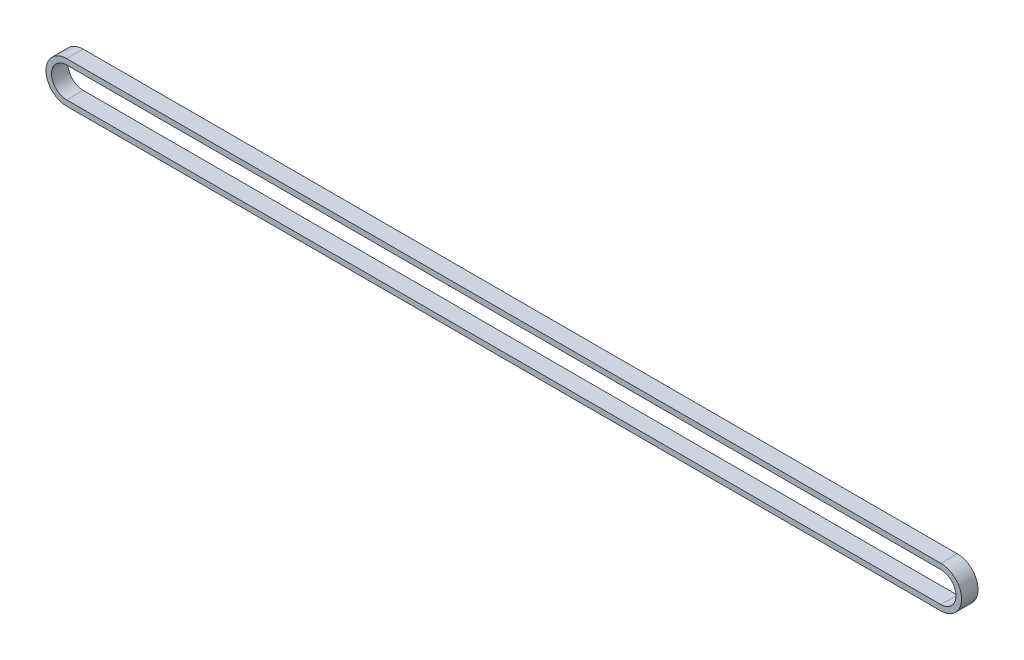
ISO-10303-21;
HEADER;
FILE_DESCRIPTION(('STEP AP214'),'2;1');
FILE_NAME('part.step','',(''),(''),'','','');
FILE_SCHEMA(('AUTOMOTIVE_DESIGN { 1 0 10303 214 1 1 1 1 }'));
ENDSEC;
DATA;
#1=APPLICATION_CONTEXT('core data for automotive mechanical design processes');
#2=APPLICATION_PROTOCOL_DEFINITION('international standard','automotive_design',2000,#1);
#3=PRODUCT_CONTEXT('',#1,'mechanical');
#4=PRODUCT('Part','Part','',(#3));
#5=PRODUCT_RELATED_PRODUCT_CATEGORY('part','',(#4));
#6=PRODUCT_DEFINITION_FORMATION('','',#4);
#7=PRODUCT_DEFINITION_CONTEXT('part definition',#1,'design');
#8=PRODUCT_DEFINITION('design','',#6,#7);
#9=PRODUCT_DEFINITION_SHAPE('','',#8);
#10=(LENGTH_UNIT() NAMED_UNIT(*) SI_UNIT(.MILLI.,.METRE.));
#11=(NAMED_UNIT(*) PLANE_ANGLE_UNIT() SI_UNIT($,.RADIAN.));
#12=(NAMED_UNIT(*) SI_UNIT($,.STERADIAN.) SOLID_ANGLE_UNIT());
#13=UNCERTAINTY_MEASURE_WITH_UNIT(LENGTH_MEASURE(1.E-05),#10,'distance_accuracy_value','');
#14=(GEOMETRIC_REPRESENTATION_CONTEXT(3) GLOBAL_UNCERTAINTY_ASSIGNED_CONTEXT((#13)) GLOBAL_UNIT_ASSIGNED_CONTEXT((#10,
#11,#12)) REPRESENTATION_CONTEXT('',''));
#15=CARTESIAN_POINT('',(0.,0.,0.));
#16=DIRECTION('',(0.,0.,1.));
#17=DIRECTION('',(1.,0.,0.));
#18=AXIS2_PLACEMENT_3D('',#15,#16,#17);
#19=CARTESIAN_POINT('',(0.,0.,6.));
#20=DIRECTION('',(0.,0.,1.));
#21=DIRECTION('',(1.,0.,0.));
#22=AXIS2_PLACEMENT_3D('',#19,#20,#21);
#23=PLANE('',#22);
#24=CARTESIAN_POINT('',(0.,0.,6.));
#25=DIRECTION('',(0.,0.,1.));
#26=DIRECTION('',(1.,0.,0.));
#27=AXIS2_PLACEMENT_3D('',#24,#25,#26);
#28=CIRCLE('',#27,7.5);
#29=CARTESIAN_POINT('',(0.,7.5,6.));
#30=VERTEX_POINT('',#29);
#31=CARTESIAN_POINT('',(0.,-7.5,6.));
#32=VERTEX_POINT('',#31);
#33=EDGE_CURVE('E136',#30,#32,#28,.T.);
#34=ORIENTED_EDGE('',*,*,#33,.T.);
#35=DIRECTION('',(1.,0.,0.));
#36=VECTOR('',#35,1.);
#37=CARTESIAN_POINT('',(0.,-7.5,6.));
#38=LINE('',#37,#36);
#39=CARTESIAN_POINT('',(318.,-7.5,6.));
#40=VERTEX_POINT('',#39);
#41=EDGE_CURVE('E139',#32,#40,#38,.T.);
#42=ORIENTED_EDGE('',*,*,#41,.T.);
#43=CARTESIAN_POINT('',(318.,0.,6.));
#44=DIRECTION('',(0.,0.,1.));
#45=DIRECTION('',(1.,0.,0.));
#46=AXIS2_PLACEMENT_3D('',#43,#44,#45);
#47=CIRCLE('',#46,7.5);
#48=CARTESIAN_POINT('',(318.,7.5,6.));
#49=VERTEX_POINT('',#48);
#50=EDGE_CURVE('E142',#40,#49,#47,.T.);
#51=ORIENTED_EDGE('',*,*,#50,.T.);
#52=DIRECTION('',(-1.,0.,0.));
#53=VECTOR('',#52,1.);
#54=CARTESIAN_POINT('',(0.,7.5,6.));
#55=LINE('',#54,#53);
#56=EDGE_CURVE('E144',#49,#30,#55,.T.);
#57=ORIENTED_EDGE('',*,*,#56,.T.);
#58=EDGE_LOOP('',(#34,#42,#51,#57));
#59=FACE_BOUND('',#58,.T.);
#60=DIRECTION('',(1.,0.,0.));
#61=VECTOR('',#60,1.);
#62=CARTESIAN_POINT('',(0.,-5.5,6.));
#63=LINE('',#62,#61);
#64=CARTESIAN_POINT('',(0.,-5.5,6.));
#65=VERTEX_POINT('',#64);
#66=CARTESIAN_POINT('',(318.,-5.5,6.));
#67=VERTEX_POINT('',#66);
#68=EDGE_CURVE('E108',#65,#67,#63,.T.);
#69=ORIENTED_EDGE('',*,*,#68,.F.);
#70=CARTESIAN_POINT('',(0.,0.,6.));
#71=DIRECTION('',(0.,0.,1.));
#72=DIRECTION('',(1.,0.,0.));
#73=AXIS2_PLACEMENT_3D('',#70,#71,#72);
#74=CIRCLE('',#73,5.5);
#75=CARTESIAN_POINT('',(0.,5.5,6.));
#76=VERTEX_POINT('',#75);
#77=EDGE_CURVE('E100',#76,#65,#74,.T.);
#78=ORIENTED_EDGE('',*,*,#77,.F.);
#79=DIRECTION('',(-1.,0.,0.));
#80=VECTOR('',#79,1.);
#81=CARTESIAN_POINT('',(0.,5.5,6.));
#82=LINE('',#81,#80);
#83=CARTESIAN_POINT('',(318.,5.5,6.));
#84=VERTEX_POINT('',#83);
#85=EDGE_CURVE('E122',#84,#76,#82,.T.);
#86=ORIENTED_EDGE('',*,*,#85,.F.);
#87=CARTESIAN_POINT('',(318.,0.,6.));
#88=DIRECTION('',(0.,0.,1.));
#89=DIRECTION('',(1.,0.,0.));
#90=AXIS2_PLACEMENT_3D('',#87,#88,#89);
#91=CIRCLE('',#90,5.5);
#92=EDGE_CURVE('E120',#67,#84,#91,.T.);
#93=ORIENTED_EDGE('',*,*,#92,.F.);
#94=EDGE_LOOP('',(#69,#78,#86,#93));
#95=FACE_BOUND('',#94,.T.);
#96=ADVANCED_FACE('F35',(#59,#95),#23,.T.);
#97=CARTESIAN_POINT('',(0.,0.,0.));
#98=DIRECTION('',(0.,0.,1.));
#99=DIRECTION('',(1.,0.,0.));
#100=AXIS2_PLACEMENT_3D('',#97,#98,#99);
#101=PLANE('',#100);
#102=CARTESIAN_POINT('',(0.,0.,0.));
#103=DIRECTION('',(0.,0.,1.));
#104=DIRECTION('',(1.,0.,0.));
#105=AXIS2_PLACEMENT_3D('',#102,#103,#104);
#106=CIRCLE('',#105,7.5);
#107=CARTESIAN_POINT('',(0.,7.5,0.));
#108=VERTEX_POINT('',#107);
#109=CARTESIAN_POINT('',(0.,-7.5,0.));
#110=VERTEX_POINT('',#109);
#111=EDGE_CURVE('E116',#108,#110,#106,.T.);
#112=ORIENTED_EDGE('',*,*,#111,.F.);
#113=DIRECTION('',(-1.,0.,0.));
#114=VECTOR('',#113,1.);
#115=CARTESIAN_POINT('',(0.,7.5,0.));
#116=LINE('',#115,#114);
#117=CARTESIAN_POINT('',(318.,7.5,0.));
#118=VERTEX_POINT('',#117);
#119=EDGE_CURVE('E140',#118,#108,#116,.T.);
#120=ORIENTED_EDGE('',*,*,#119,.F.);
#121=CARTESIAN_POINT('',(318.,0.,0.));
#122=DIRECTION('',(0.,0.,1.));
#123=DIRECTION('',(1.,0.,0.));
#124=AXIS2_PLACEMENT_3D('',#121,#122,#123);
#125=CIRCLE('',#124,7.5);
#126=CARTESIAN_POINT('',(318.,-7.5,0.));
#127=VERTEX_POINT('',#126);
#128=EDGE_CURVE('E151',#127,#118,#125,.T.);
#129=ORIENTED_EDGE('',*,*,#128,.F.);
#130=DIRECTION('',(1.,0.,0.));
#131=VECTOR('',#130,1.);
#132=CARTESIAN_POINT('',(0.,-7.5,0.));
#133=LINE('',#132,#131);
#134=EDGE_CURVE('E149',#110,#127,#133,.T.);
#135=ORIENTED_EDGE('',*,*,#134,.F.);
#136=EDGE_LOOP('',(#112,#120,#129,#135));
#137=FACE_BOUND('',#136,.T.);
#138=CARTESIAN_POINT('',(0.,0.,0.));
#139=DIRECTION('',(0.,0.,1.));
#140=DIRECTION('',(1.,0.,0.));
#141=AXIS2_PLACEMENT_3D('',#138,#139,#140);
#142=CIRCLE('',#141,5.5);
#143=CARTESIAN_POINT('',(0.,5.5,0.));
#144=VERTEX_POINT('',#143);
#145=CARTESIAN_POINT('',(0.,-5.5,0.));
#146=VERTEX_POINT('',#145);
#147=EDGE_CURVE('E58',#144,#146,#142,.T.);
#148=ORIENTED_EDGE('',*,*,#147,.T.);
#149=DIRECTION('',(1.,0.,0.));
#150=VECTOR('',#149,1.);
#151=CARTESIAN_POINT('',(0.,-5.5,0.));
#152=LINE('',#151,#150);
#153=CARTESIAN_POINT('',(318.,-5.5,0.));
#154=VERTEX_POINT('',#153);
#155=EDGE_CURVE('E115',#146,#154,#152,.T.);
#156=ORIENTED_EDGE('',*,*,#155,.T.);
#157=CARTESIAN_POINT('',(318.,0.,0.));
#158=DIRECTION('',(0.,0.,1.));
#159=DIRECTION('',(1.,0.,0.));
#160=AXIS2_PLACEMENT_3D('',#157,#158,#159);
#161=CIRCLE('',#160,5.5);
#162=CARTESIAN_POINT('',(318.,5.5,0.));
#163=VERTEX_POINT('',#162);
#164=EDGE_CURVE('E128',#154,#163,#161,.T.);
#165=ORIENTED_EDGE('',*,*,#164,.T.);
#166=DIRECTION('',(-1.,0.,0.));
#167=VECTOR('',#166,1.);
#168=CARTESIAN_POINT('',(0.,5.5,0.));
#169=LINE('',#168,#167);
#170=EDGE_CURVE('E109',#163,#144,#169,.T.);
#171=ORIENTED_EDGE('',*,*,#170,.T.);
#172=EDGE_LOOP('',(#148,#156,#165,#171));
#173=FACE_BOUND('',#172,.T.);
#174=ADVANCED_FACE('F169',(#137,#173),#101,.F.);
#175=CARTESIAN_POINT('',(0.,0.,6.));
#176=DIRECTION('',(0.,0.,-1.));
#177=DIRECTION('',(-1.,0.,0.));
#178=AXIS2_PLACEMENT_3D('',#175,#176,#177);
#179=CYLINDRICAL_SURFACE('',#178,7.5);
#180=ORIENTED_EDGE('',*,*,#111,.T.);
#181=DIRECTION('',(0.,0.,-1.));
#182=VECTOR('',#181,1.);
#183=CARTESIAN_POINT('',(0.,-7.5,6.));
#184=LINE('',#183,#182);
#185=EDGE_CURVE('E11',#32,#110,#184,.T.);
#186=ORIENTED_EDGE('',*,*,#185,.F.);
#187=ORIENTED_EDGE('',*,*,#33,.F.);
#188=DIRECTION('',(0.,0.,-1.));
#189=VECTOR('',#188,1.);
#190=CARTESIAN_POINT('',(0.,7.5,6.));
#191=LINE('',#190,#189);
#192=EDGE_CURVE('E146',#30,#108,#191,.T.);
#193=ORIENTED_EDGE('',*,*,#192,.T.);
#194=EDGE_LOOP('',(#180,#186,#187,#193));
#195=FACE_BOUND('',#194,.T.);
#196=ADVANCED_FACE('F37',(#195),#179,.T.);
#197=CARTESIAN_POINT('',(0.,-7.5,6.));
#198=DIRECTION('',(0.,1.,0.));
#199=DIRECTION('',(0.,0.,1.));
#200=AXIS2_PLACEMENT_3D('',#197,#198,#199);
#201=PLANE('',#200);
#202=ORIENTED_EDGE('',*,*,#134,.T.);
#203=DIRECTION('',(0.,0.,-1.));
#204=VECTOR('',#203,1.);
#205=CARTESIAN_POINT('',(318.,-7.5,6.));
#206=LINE('',#205,#204);
#207=EDGE_CURVE('E43',#40,#127,#206,.T.);
#208=ORIENTED_EDGE('',*,*,#207,.F.);
#209=ORIENTED_EDGE('',*,*,#41,.F.);
#210=ORIENTED_EDGE('',*,*,#185,.T.);
#211=EDGE_LOOP('',(#202,#208,#209,#210));
#212=FACE_BOUND('',#211,.T.);
#213=ADVANCED_FACE('F179',(#212),#201,.F.);
#214=CARTESIAN_POINT('',(318.,0.,6.));
#215=DIRECTION('',(0.,0.,-1.));
#216=DIRECTION('',(-1.,0.,0.));
#217=AXIS2_PLACEMENT_3D('',#214,#215,#216);
#218=CYLINDRICAL_SURFACE('',#217,7.5);
#219=ORIENTED_EDGE('',*,*,#128,.T.);
#220=DIRECTION('',(0.,0.,-1.));
#221=VECTOR('',#220,1.);
#222=CARTESIAN_POINT('',(318.,7.5,6.));
#223=LINE('',#222,#221);
#224=EDGE_CURVE('E156',#49,#118,#223,.T.);
#225=ORIENTED_EDGE('',*,*,#224,.F.);
#226=ORIENTED_EDGE('',*,*,#50,.F.);
#227=ORIENTED_EDGE('',*,*,#207,.T.);
#228=EDGE_LOOP('',(#219,#225,#226,#227));
#229=FACE_BOUND('',#228,.T.);
#230=ADVANCED_FACE('F163',(#229),#218,.T.);
#231=CARTESIAN_POINT('',(0.,7.5,6.));
#232=DIRECTION('',(0.,-1.,0.));
#233=DIRECTION('',(0.,0.,-1.));
#234=AXIS2_PLACEMENT_3D('',#231,#232,#233);
#235=PLANE('',#234);
#236=ORIENTED_EDGE('',*,*,#119,.T.);
#237=ORIENTED_EDGE('',*,*,#192,.F.);
#238=ORIENTED_EDGE('',*,*,#56,.F.);
#239=ORIENTED_EDGE('',*,*,#224,.T.);
#240=EDGE_LOOP('',(#236,#237,#238,#239));
#241=FACE_BOUND('',#240,.T.);
#242=ADVANCED_FACE('F173',(#241),#235,.F.);
#243=CARTESIAN_POINT('',(0.,0.,6.));
#244=DIRECTION('',(0.,0.,-1.));
#245=DIRECTION('',(-1.,0.,0.));
#246=AXIS2_PLACEMENT_3D('',#243,#244,#245);
#247=CYLINDRICAL_SURFACE('',#246,5.5);
#248=ORIENTED_EDGE('',*,*,#147,.F.);
#249=DIRECTION('',(0.,0.,-1.));
#250=VECTOR('',#249,1.);
#251=CARTESIAN_POINT('',(0.,5.5,6.));
#252=LINE('',#251,#250);
#253=EDGE_CURVE('E104',#76,#144,#252,.T.);
#254=ORIENTED_EDGE('',*,*,#253,.F.);
#255=ORIENTED_EDGE('',*,*,#77,.T.);
#256=DIRECTION('',(0.,0.,-1.));
#257=VECTOR('',#256,1.);
#258=CARTESIAN_POINT('',(0.,-5.5,6.));
#259=LINE('',#258,#257);
#260=EDGE_CURVE('E103',#65,#146,#259,.T.);
#261=ORIENTED_EDGE('',*,*,#260,.T.);
#262=EDGE_LOOP('',(#248,#254,#255,#261));
#263=FACE_BOUND('',#262,.T.);
#264=ADVANCED_FACE('F102',(#263),#247,.F.);
#265=CARTESIAN_POINT('',(0.,-5.5,6.));
#266=DIRECTION('',(0.,1.,0.));
#267=DIRECTION('',(0.,0.,1.));
#268=AXIS2_PLACEMENT_3D('',#265,#266,#267);
#269=PLANE('',#268);
#270=ORIENTED_EDGE('',*,*,#155,.F.);
#271=ORIENTED_EDGE('',*,*,#260,.F.);
#272=ORIENTED_EDGE('',*,*,#68,.T.);
#273=DIRECTION('',(0.,0.,-1.));
#274=VECTOR('',#273,1.);
#275=CARTESIAN_POINT('',(318.,-5.5,6.));
#276=LINE('',#275,#274);
#277=EDGE_CURVE('E117',#67,#154,#276,.T.);
#278=ORIENTED_EDGE('',*,*,#277,.T.);
#279=EDGE_LOOP('',(#270,#271,#272,#278));
#280=FACE_BOUND('',#279,.T.);
#281=ADVANCED_FACE('F112',(#280),#269,.T.);
#282=CARTESIAN_POINT('',(318.,0.,6.));
#283=DIRECTION('',(0.,0.,-1.));
#284=DIRECTION('',(-1.,0.,0.));
#285=AXIS2_PLACEMENT_3D('',#282,#283,#284);
#286=CYLINDRICAL_SURFACE('',#285,5.5);
#287=ORIENTED_EDGE('',*,*,#164,.F.);
#288=ORIENTED_EDGE('',*,*,#277,.F.);
#289=ORIENTED_EDGE('',*,*,#92,.T.);
#290=DIRECTION('',(0.,0.,-1.));
#291=VECTOR('',#290,1.);
#292=CARTESIAN_POINT('',(318.,5.5,6.));
#293=LINE('',#292,#291);
#294=EDGE_CURVE('E50',#84,#163,#293,.T.);
#295=ORIENTED_EDGE('',*,*,#294,.T.);
#296=EDGE_LOOP('',(#287,#288,#289,#295));
#297=FACE_BOUND('',#296,.T.);
#298=ADVANCED_FACE('F202',(#297),#286,.F.);
#299=CARTESIAN_POINT('',(0.,5.5,6.));
#300=DIRECTION('',(0.,-1.,0.));
#301=DIRECTION('',(0.,0.,-1.));
#302=AXIS2_PLACEMENT_3D('',#299,#300,#301);
#303=PLANE('',#302);
#304=ORIENTED_EDGE('',*,*,#170,.F.);
#305=ORIENTED_EDGE('',*,*,#294,.F.);
#306=ORIENTED_EDGE('',*,*,#85,.T.);
#307=ORIENTED_EDGE('',*,*,#253,.T.);
#308=EDGE_LOOP('',(#304,#305,#306,#307));
#309=FACE_BOUND('',#308,.T.);
#310=ADVANCED_FACE('F206',(#309),#303,.T.);
#311=CLOSED_SHELL('',(#96,#174,#196,#213,#230,#242,#264,#281,#298,#310));
#312=MANIFOLD_SOLID_BREP('B2',#311);
#313=ADVANCED_BREP_SHAPE_REPRESENTATION('',(#18,#312),#14);
#314=SHAPE_DEFINITION_REPRESENTATION(#9,#313);
ENDSEC;
END-ISO-10303-21;
